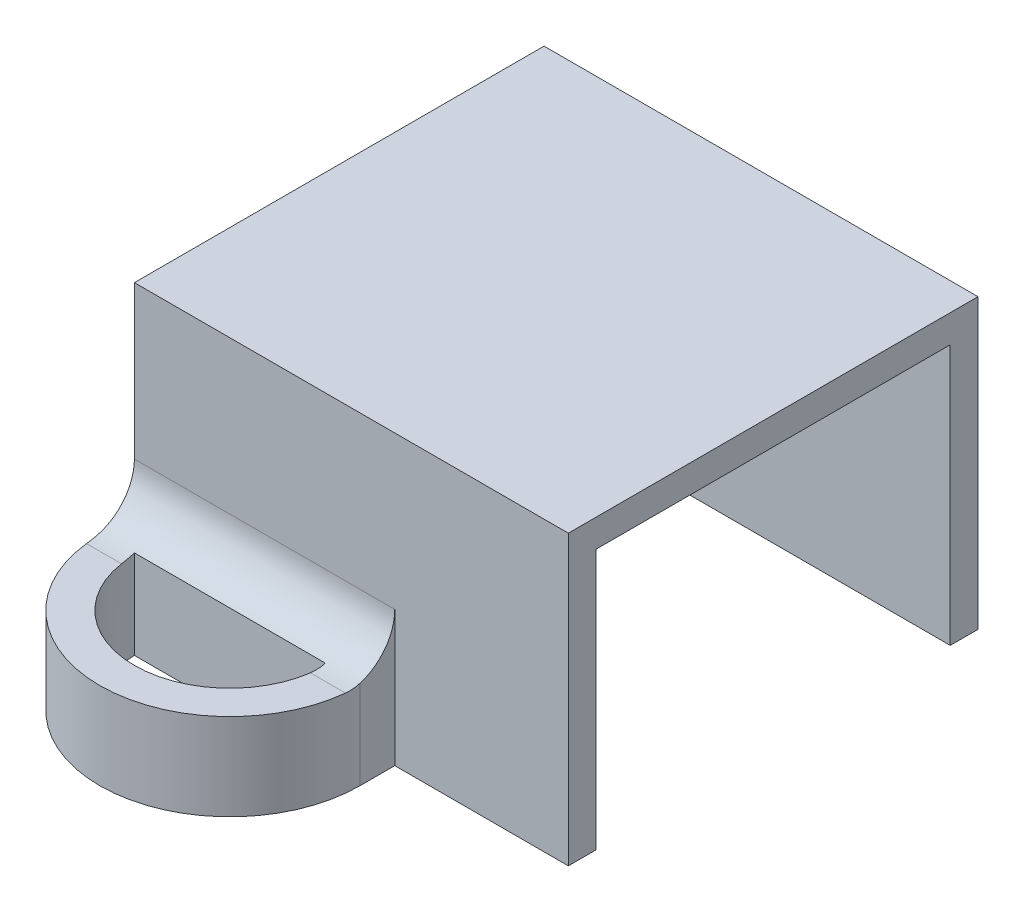
ISO-10303-21;
HEADER;
FILE_DESCRIPTION(('STEP AP214'),'2;1');
FILE_NAME('part.step','',(''),(''),'','','');
FILE_SCHEMA(('AUTOMOTIVE_DESIGN { 1 0 10303 214 1 1 1 1 }'));
ENDSEC;
DATA;
#1=APPLICATION_CONTEXT('core data for automotive mechanical design processes');
#2=APPLICATION_PROTOCOL_DEFINITION('international standard','automotive_design',2000,#1);
#3=PRODUCT_CONTEXT('',#1,'mechanical');
#4=PRODUCT('Part','Part','',(#3));
#5=PRODUCT_RELATED_PRODUCT_CATEGORY('part','',(#4));
#6=PRODUCT_DEFINITION_FORMATION('','',#4);
#7=PRODUCT_DEFINITION_CONTEXT('part definition',#1,'design');
#8=PRODUCT_DEFINITION('design','',#6,#7);
#9=PRODUCT_DEFINITION_SHAPE('','',#8);
#10=(LENGTH_UNIT() NAMED_UNIT(*) SI_UNIT(.MILLI.,.METRE.));
#11=(NAMED_UNIT(*) PLANE_ANGLE_UNIT() SI_UNIT($,.RADIAN.));
#12=(NAMED_UNIT(*) SI_UNIT($,.STERADIAN.) SOLID_ANGLE_UNIT());
#13=UNCERTAINTY_MEASURE_WITH_UNIT(LENGTH_MEASURE(1.E-05),#10,'distance_accuracy_value','');
#14=(GEOMETRIC_REPRESENTATION_CONTEXT(3) GLOBAL_UNCERTAINTY_ASSIGNED_CONTEXT((#13)) GLOBAL_UNIT_ASSIGNED_CONTEXT((#10,
#11,#12)) REPRESENTATION_CONTEXT('',''));
#15=CARTESIAN_POINT('',(0.,0.,0.));
#16=DIRECTION('',(0.,0.,1.));
#17=DIRECTION('',(1.,0.,0.));
#18=AXIS2_PLACEMENT_3D('',#15,#16,#17);
#19=CARTESIAN_POINT('',(15.875,0.,-13.97));
#20=DIRECTION('',(0.,1.,0.));
#21=DIRECTION('',(0.,0.,1.));
#22=AXIS2_PLACEMENT_3D('',#19,#20,#21);
#23=PLANE('',#22);
#24=DIRECTION('',(0.,0.,-1.));
#25=VECTOR('',#24,1.);
#26=CARTESIAN_POINT('',(0.,0.,-13.97));
#27=LINE('',#26,#25);
#28=CARTESIAN_POINT('',(0.,0.,-12.954));
#29=VERTEX_POINT('',#28);
#30=CARTESIAN_POINT('',(0.,0.,-15.24));
#31=VERTEX_POINT('',#30);
#32=EDGE_CURVE('E293',#29,#31,#27,.T.);
#33=ORIENTED_EDGE('',*,*,#32,.T.);
#34=CARTESIAN_POINT('',(4.7625,0.,-15.24));
#35=DIRECTION('',(0.,1.,0.));
#36=DIRECTION('',(0.,0.,1.));
#37=AXIS2_PLACEMENT_3D('',#34,#35,#36);
#38=CIRCLE('',#37,4.7625);
#39=CARTESIAN_POINT('',(9.525,0.,-15.24));
#40=VERTEX_POINT('',#39);
#41=EDGE_CURVE('E212',#40,#31,#38,.T.);
#42=ORIENTED_EDGE('',*,*,#41,.F.);
#43=DIRECTION('',(0.,0.,-1.));
#44=VECTOR('',#43,1.);
#45=CARTESIAN_POINT('',(9.525,0.,-15.24));
#46=LINE('',#45,#44);
#47=CARTESIAN_POINT('',(9.525,0.,-13.97));
#48=VERTEX_POINT('',#47);
#49=EDGE_CURVE('E230',#48,#40,#46,.T.);
#50=ORIENTED_EDGE('',*,*,#49,.F.);
#51=DIRECTION('',(-1.,0.,0.));
#52=VECTOR('',#51,1.);
#53=CARTESIAN_POINT('',(15.875,0.,-13.97));
#54=LINE('',#53,#52);
#55=CARTESIAN_POINT('',(15.875,0.,-13.97));
#56=VERTEX_POINT('',#55);
#57=EDGE_CURVE('E314',#56,#48,#54,.T.);
#58=ORIENTED_EDGE('',*,*,#57,.F.);
#59=DIRECTION('',(0.,0.,-1.));
#60=VECTOR('',#59,1.);
#61=CARTESIAN_POINT('',(15.875,0.,-13.97));
#62=LINE('',#61,#60);
#63=CARTESIAN_POINT('',(15.875,0.,-12.954));
#64=VERTEX_POINT('',#63);
#65=EDGE_CURVE('E276',#64,#56,#62,.T.);
#66=ORIENTED_EDGE('',*,*,#65,.F.);
#67=DIRECTION('',(-1.,0.,0.));
#68=VECTOR('',#67,1.);
#69=CARTESIAN_POINT('',(15.875,0.,-12.954));
#70=LINE('',#69,#68);
#71=EDGE_CURVE('E316',#64,#29,#70,.T.);
#72=ORIENTED_EDGE('',*,*,#71,.T.);
#73=EDGE_LOOP('',(#33,#42,#50,#58,#66,#72));
#74=FACE_BOUND('',#73,.T.);
#75=CARTESIAN_POINT('',(4.7625,0.,-15.24));
#76=DIRECTION('',(0.,1.,0.));
#77=DIRECTION('',(0.,0.,1.));
#78=AXIS2_PLACEMENT_3D('',#75,#76,#77);
#79=CIRCLE('',#78,3.4925);
#80=CARTESIAN_POINT('',(8.255,0.,-15.24));
#81=VERTEX_POINT('',#80);
#82=CARTESIAN_POINT('',(1.27,0.,-15.24));
#83=VERTEX_POINT('',#82);
#84=EDGE_CURVE('E216',#81,#83,#79,.T.);
#85=ORIENTED_EDGE('',*,*,#84,.T.);
#86=DIRECTION('',(1.,0.,0.));
#87=VECTOR('',#86,1.);
#88=CARTESIAN_POINT('',(8.255,0.,-15.24));
#89=LINE('',#88,#87);
#90=EDGE_CURVE('E202',#83,#81,#89,.T.);
#91=ORIENTED_EDGE('',*,*,#90,.T.);
#92=EDGE_LOOP('',(#85,#91));
#93=FACE_BOUND('',#92,.T.);
#94=ADVANCED_FACE('F47',(#74,#93),#23,.F.);
#95=CARTESIAN_POINT('',(4.7625,3.17499999999999,-15.24));
#96=DIRECTION('',(0.,-1.,0.));
#97=DIRECTION('',(0.,0.,1.));
#98=AXIS2_PLACEMENT_3D('',#95,#96,#97);
#99=PLANE('',#98);
#100=CARTESIAN_POINT('',(4.7625,3.17499999999999,-15.24));
#101=DIRECTION('',(0.,1.,0.));
#102=DIRECTION('',(0.,0.,1.));
#103=AXIS2_PLACEMENT_3D('',#100,#101,#102);
#104=CIRCLE('',#103,4.7625);
#105=CARTESIAN_POINT('',(9.49782915962555,3.17499999999999,-15.748));
#106=VERTEX_POINT('',#105);
#107=CARTESIAN_POINT('',(0.0271708403744514,3.17499999999999,-15.748));
#108=VERTEX_POINT('',#107);
#109=EDGE_CURVE('E227',#106,#108,#104,.T.);
#110=ORIENTED_EDGE('',*,*,#109,.T.);
#111=DIRECTION('',(1.,0.,0.));
#112=VECTOR('',#111,1.);
#113=CARTESIAN_POINT('',(9.525,3.17499999999999,-15.748));
#114=LINE('',#113,#112);
#115=CARTESIAN_POINT('',(1.30714296345515,3.17499999999999,-15.748));
#116=VERTEX_POINT('',#115);
#117=EDGE_CURVE('E381',#108,#116,#114,.T.);
#118=ORIENTED_EDGE('',*,*,#117,.T.);
#119=CARTESIAN_POINT('',(4.7625,3.17499999999999,-15.24));
#120=DIRECTION('',(0.,-1.,0.));
#121=DIRECTION('',(0.,0.,-1.));
#122=AXIS2_PLACEMENT_3D('',#119,#120,#121);
#123=CIRCLE('',#122,3.4925);
#124=CARTESIAN_POINT('',(8.21785703654485,3.17499999999999,-15.748));
#125=VERTEX_POINT('',#124);
#126=EDGE_CURVE('E220',#116,#125,#123,.T.);
#127=ORIENTED_EDGE('',*,*,#126,.T.);
#128=DIRECTION('',(1.,0.,0.));
#129=VECTOR('',#128,1.);
#130=CARTESIAN_POINT('',(9.525,3.17499999999999,-15.748));
#131=LINE('',#130,#129);
#132=EDGE_CURVE('E379',#125,#106,#131,.T.);
#133=ORIENTED_EDGE('',*,*,#132,.T.);
#134=EDGE_LOOP('',(#110,#118,#127,#133));
#135=FACE_BOUND('',#134,.T.);
#136=ADVANCED_FACE('F399',(#135),#99,.F.);
#137=CARTESIAN_POINT('',(15.875,0.,-13.97));
#138=DIRECTION('',(0.,0.,1.));
#139=DIRECTION('',(1.,0.,0.));
#140=AXIS2_PLACEMENT_3D('',#137,#138,#139);
#141=PLANE('',#140);
#142=DIRECTION('',(0.,-1.,0.));
#143=VECTOR('',#142,1.);
#144=CARTESIAN_POINT('',(9.525,3.17499999999999,-13.97));
#145=LINE('',#144,#143);
#146=CARTESIAN_POINT('',(9.525,4.95299999999999,-13.97));
#147=VERTEX_POINT('',#146);
#148=EDGE_CURVE('E233',#147,#48,#145,.T.);
#149=ORIENTED_EDGE('',*,*,#148,.F.);
#150=DIRECTION('',(1.,0.,0.));
#151=VECTOR('',#150,1.);
#152=CARTESIAN_POINT('',(0.,4.95299999999999,-13.97));
#153=LINE('',#152,#151);
#154=CARTESIAN_POINT('',(0.,4.95299999999999,-13.97));
#155=VERTEX_POINT('',#154);
#156=EDGE_CURVE('E384',#147,#155,#153,.F.);
#157=ORIENTED_EDGE('',*,*,#156,.T.);
#158=DIRECTION('',(0.,1.,0.));
#159=VECTOR('',#158,1.);
#160=CARTESIAN_POINT('',(0.,0.,-13.97));
#161=LINE('',#160,#159);
#162=CARTESIAN_POINT('',(0.,10.541,-13.97));
#163=VERTEX_POINT('',#162);
#164=EDGE_CURVE('E295',#155,#163,#161,.T.);
#165=ORIENTED_EDGE('',*,*,#164,.T.);
#166=DIRECTION('',(-1.,0.,0.));
#167=VECTOR('',#166,1.);
#168=CARTESIAN_POINT('',(15.875,10.541,-13.97));
#169=LINE('',#168,#167);
#170=CARTESIAN_POINT('',(15.875,10.541,-13.97));
#171=VERTEX_POINT('',#170);
#172=EDGE_CURVE('E311',#171,#163,#169,.T.);
#173=ORIENTED_EDGE('',*,*,#172,.F.);
#174=DIRECTION('',(0.,1.,0.));
#175=VECTOR('',#174,1.);
#176=CARTESIAN_POINT('',(15.875,0.,-13.97));
#177=LINE('',#176,#175);
#178=EDGE_CURVE('E278',#56,#171,#177,.T.);
#179=ORIENTED_EDGE('',*,*,#178,.F.);
#180=ORIENTED_EDGE('',*,*,#57,.T.);
#181=EDGE_LOOP('',(#149,#157,#165,#173,#179,#180));
#182=FACE_BOUND('',#181,.T.);
#183=ADVANCED_FACE('F438',(#182),#141,.F.);
#184=CARTESIAN_POINT('',(15.875,0.,0.));
#185=DIRECTION('',(0.,0.,1.));
#186=DIRECTION('',(1.,0.,0.));
#187=AXIS2_PLACEMENT_3D('',#184,#185,#186);
#188=PLANE('',#187);
#189=DIRECTION('',(0.,1.,0.));
#190=VECTOR('',#189,1.);
#191=CARTESIAN_POINT('',(0.,0.,0.));
#192=LINE('',#191,#190);
#193=CARTESIAN_POINT('',(0.,0.,0.));
#194=VERTEX_POINT('',#193);
#195=CARTESIAN_POINT('',(0.,9.525,0.));
#196=VERTEX_POINT('',#195);
#197=EDGE_CURVE('E263',#194,#196,#192,.T.);
#198=ORIENTED_EDGE('',*,*,#197,.T.);
#199=DIRECTION('',(-1.,0.,0.));
#200=VECTOR('',#199,1.);
#201=CARTESIAN_POINT('',(15.875,9.525,0.));
#202=LINE('',#201,#200);
#203=CARTESIAN_POINT('',(15.875,9.525,0.));
#204=VERTEX_POINT('',#203);
#205=EDGE_CURVE('E322',#204,#196,#202,.T.);
#206=ORIENTED_EDGE('',*,*,#205,.F.);
#207=DIRECTION('',(0.,1.,0.));
#208=VECTOR('',#207,1.);
#209=CARTESIAN_POINT('',(15.875,0.,0.));
#210=LINE('',#209,#208);
#211=CARTESIAN_POINT('',(15.875,0.,0.));
#212=VERTEX_POINT('',#211);
#213=EDGE_CURVE('E268',#212,#204,#210,.T.);
#214=ORIENTED_EDGE('',*,*,#213,.F.);
#215=DIRECTION('',(-1.,0.,0.));
#216=VECTOR('',#215,1.);
#217=CARTESIAN_POINT('',(15.875,0.,0.));
#218=LINE('',#217,#216);
#219=EDGE_CURVE('E286',#212,#194,#218,.T.);
#220=ORIENTED_EDGE('',*,*,#219,.T.);
#221=EDGE_LOOP('',(#198,#206,#214,#220));
#222=FACE_BOUND('',#221,.T.);
#223=ADVANCED_FACE('F450',(#222),#188,.F.);
#224=CARTESIAN_POINT('',(15.875,9.525,0.));
#225=DIRECTION('',(0.,1.,0.));
#226=DIRECTION('',(0.,0.,1.));
#227=AXIS2_PLACEMENT_3D('',#224,#225,#226);
#228=PLANE('',#227);
#229=DIRECTION('',(0.,0.,-1.));
#230=VECTOR('',#229,1.);
#231=CARTESIAN_POINT('',(0.,9.525,0.));
#232=LINE('',#231,#230);
#233=CARTESIAN_POINT('',(0.,9.525,-12.954));
#234=VERTEX_POINT('',#233);
#235=EDGE_CURVE('E289',#196,#234,#232,.T.);
#236=ORIENTED_EDGE('',*,*,#235,.T.);
#237=DIRECTION('',(-1.,0.,0.));
#238=VECTOR('',#237,1.);
#239=CARTESIAN_POINT('',(15.875,9.525,-12.954));
#240=LINE('',#239,#238);
#241=CARTESIAN_POINT('',(15.875,9.525,-12.954));
#242=VERTEX_POINT('',#241);
#243=EDGE_CURVE('E319',#242,#234,#240,.T.);
#244=ORIENTED_EDGE('',*,*,#243,.F.);
#245=DIRECTION('',(0.,0.,-1.));
#246=VECTOR('',#245,1.);
#247=CARTESIAN_POINT('',(15.875,9.525,0.));
#248=LINE('',#247,#246);
#249=EDGE_CURVE('E271',#204,#242,#248,.T.);
#250=ORIENTED_EDGE('',*,*,#249,.F.);
#251=ORIENTED_EDGE('',*,*,#205,.T.);
#252=EDGE_LOOP('',(#236,#244,#250,#251));
#253=FACE_BOUND('',#252,.T.);
#254=ADVANCED_FACE('F447',(#253),#228,.F.);
#255=CARTESIAN_POINT('',(15.875,0.,-12.954));
#256=DIRECTION('',(0.,0.,-1.));
#257=DIRECTION('',(-1.,0.,0.));
#258=AXIS2_PLACEMENT_3D('',#255,#256,#257);
#259=PLANE('',#258);
#260=DIRECTION('',(0.,-1.,0.));
#261=VECTOR('',#260,1.);
#262=CARTESIAN_POINT('',(0.,0.,-12.954));
#263=LINE('',#262,#261);
#264=EDGE_CURVE('E291',#234,#29,#263,.T.);
#265=ORIENTED_EDGE('',*,*,#264,.T.);
#266=ORIENTED_EDGE('',*,*,#71,.F.);
#267=DIRECTION('',(0.,-1.,0.));
#268=VECTOR('',#267,1.);
#269=CARTESIAN_POINT('',(15.875,0.,-12.954));
#270=LINE('',#269,#268);
#271=EDGE_CURVE('E274',#242,#64,#270,.T.);
#272=ORIENTED_EDGE('',*,*,#271,.F.);
#273=ORIENTED_EDGE('',*,*,#243,.T.);
#274=EDGE_LOOP('',(#265,#266,#272,#273));
#275=FACE_BOUND('',#274,.T.);
#276=ADVANCED_FACE('F443',(#275),#259,.F.);
#277=CARTESIAN_POINT('',(15.875,10.541,-13.97));
#278=DIRECTION('',(0.,-1.,0.));
#279=DIRECTION('',(0.,0.,-1.));
#280=AXIS2_PLACEMENT_3D('',#277,#278,#279);
#281=PLANE('',#280);
#282=DIRECTION('',(0.,0.,1.));
#283=VECTOR('',#282,1.);
#284=CARTESIAN_POINT('',(0.,10.541,-13.97));
#285=LINE('',#284,#283);
#286=CARTESIAN_POINT('',(0.,10.541,1.016));
#287=VERTEX_POINT('',#286);
#288=EDGE_CURVE('E297',#163,#287,#285,.T.);
#289=ORIENTED_EDGE('',*,*,#288,.T.);
#290=DIRECTION('',(-1.,0.,0.));
#291=VECTOR('',#290,1.);
#292=CARTESIAN_POINT('',(15.875,10.541,1.016));
#293=LINE('',#292,#291);
#294=CARTESIAN_POINT('',(15.875,10.541,1.016));
#295=VERTEX_POINT('',#294);
#296=EDGE_CURVE('E308',#295,#287,#293,.T.);
#297=ORIENTED_EDGE('',*,*,#296,.F.);
#298=DIRECTION('',(0.,0.,1.));
#299=VECTOR('',#298,1.);
#300=CARTESIAN_POINT('',(15.875,10.541,-13.97));
#301=LINE('',#300,#299);
#302=EDGE_CURVE('E280',#171,#295,#301,.T.);
#303=ORIENTED_EDGE('',*,*,#302,.F.);
#304=ORIENTED_EDGE('',*,*,#172,.T.);
#305=EDGE_LOOP('',(#289,#297,#303,#304));
#306=FACE_BOUND('',#305,.T.);
#307=ADVANCED_FACE('F446',(#306),#281,.F.);
#308=CARTESIAN_POINT('',(15.875,0.,1.016));
#309=DIRECTION('',(0.,0.,-1.));
#310=DIRECTION('',(0.,1.,0.));
#311=AXIS2_PLACEMENT_3D('',#308,#309,#310);
#312=PLANE('',#311);
#313=DIRECTION('',(0.,-1.,0.));
#314=VECTOR('',#313,1.);
#315=CARTESIAN_POINT('',(0.,0.,1.016));
#316=LINE('',#315,#314);
#317=CARTESIAN_POINT('',(0.,4.95299999999999,1.016));
#318=VERTEX_POINT('',#317);
#319=EDGE_CURVE('E299',#287,#318,#316,.T.);
#320=ORIENTED_EDGE('',*,*,#319,.T.);
#321=DIRECTION('',(1.,0.,0.));
#322=VECTOR('',#321,1.);
#323=CARTESIAN_POINT('',(9.525,4.95299999999999,1.016));
#324=LINE('',#323,#322);
#325=CARTESIAN_POINT('',(9.525,4.95299999999999,1.01600000000001));
#326=VERTEX_POINT('',#325);
#327=EDGE_CURVE('E325',#318,#326,#324,.T.);
#328=ORIENTED_EDGE('',*,*,#327,.T.);
#329=DIRECTION('',(0.,-1.,0.));
#330=VECTOR('',#329,1.);
#331=CARTESIAN_POINT('',(9.525,3.17499999999999,1.01600000000001));
#332=LINE('',#331,#330);
#333=CARTESIAN_POINT('',(9.525,0.,1.016));
#334=VERTEX_POINT('',#333);
#335=EDGE_CURVE('E254',#326,#334,#332,.T.);
#336=ORIENTED_EDGE('',*,*,#335,.T.);
#337=DIRECTION('',(-1.,0.,0.));
#338=VECTOR('',#337,1.);
#339=CARTESIAN_POINT('',(15.875,0.,1.016));
#340=LINE('',#339,#338);
#341=CARTESIAN_POINT('',(15.875,0.,1.016));
#342=VERTEX_POINT('',#341);
#343=EDGE_CURVE('E305',#342,#334,#340,.T.);
#344=ORIENTED_EDGE('',*,*,#343,.F.);
#345=DIRECTION('',(0.,-1.,0.));
#346=VECTOR('',#345,1.);
#347=CARTESIAN_POINT('',(15.875,0.,1.016));
#348=LINE('',#347,#346);
#349=EDGE_CURVE('E282',#295,#342,#348,.T.);
#350=ORIENTED_EDGE('',*,*,#349,.F.);
#351=ORIENTED_EDGE('',*,*,#296,.T.);
#352=EDGE_LOOP('',(#320,#328,#336,#344,#350,#351));
#353=FACE_BOUND('',#352,.T.);
#354=ADVANCED_FACE('F482',(#353),#312,.F.);
#355=CARTESIAN_POINT('',(15.875,0.,0.));
#356=DIRECTION('',(0.,1.,0.));
#357=DIRECTION('',(0.,0.,1.));
#358=AXIS2_PLACEMENT_3D('',#355,#356,#357);
#359=PLANE('',#358);
#360=DIRECTION('',(1.,0.,0.));
#361=VECTOR('',#360,1.);
#362=CARTESIAN_POINT('',(8.255,0.,2.286));
#363=LINE('',#362,#361);
#364=CARTESIAN_POINT('',(1.27,0.,2.286));
#365=VERTEX_POINT('',#364);
#366=CARTESIAN_POINT('',(8.255,0.,2.286));
#367=VERTEX_POINT('',#366);
#368=EDGE_CURVE('E246',#365,#367,#363,.T.);
#369=ORIENTED_EDGE('',*,*,#368,.F.);
#370=CARTESIAN_POINT('',(4.7625,0.,2.286));
#371=DIRECTION('',(0.,1.,0.));
#372=DIRECTION('',(0.,0.,1.));
#373=AXIS2_PLACEMENT_3D('',#370,#371,#372);
#374=CIRCLE('',#373,3.4925);
#375=EDGE_CURVE('E236',#367,#365,#374,.F.);
#376=ORIENTED_EDGE('',*,*,#375,.F.);
#377=EDGE_LOOP('',(#369,#376));
#378=FACE_BOUND('',#377,.T.);
#379=DIRECTION('',(0.,0.,-1.));
#380=VECTOR('',#379,1.);
#381=CARTESIAN_POINT('',(0.,0.,0.));
#382=LINE('',#381,#380);
#383=CARTESIAN_POINT('',(0.,0.,2.286));
#384=VERTEX_POINT('',#383);
#385=EDGE_CURVE('E272',#384,#194,#382,.T.);
#386=ORIENTED_EDGE('',*,*,#385,.T.);
#387=ORIENTED_EDGE('',*,*,#219,.F.);
#388=DIRECTION('',(0.,0.,-1.));
#389=VECTOR('',#388,1.);
#390=CARTESIAN_POINT('',(15.875,0.,0.));
#391=LINE('',#390,#389);
#392=EDGE_CURVE('E284',#342,#212,#391,.T.);
#393=ORIENTED_EDGE('',*,*,#392,.F.);
#394=ORIENTED_EDGE('',*,*,#343,.T.);
#395=DIRECTION('',(0.,0.,1.));
#396=VECTOR('',#395,1.);
#397=CARTESIAN_POINT('',(9.525,0.,2.286));
#398=LINE('',#397,#396);
#399=CARTESIAN_POINT('',(9.525,0.,2.286));
#400=VERTEX_POINT('',#399);
#401=EDGE_CURVE('E250',#334,#400,#398,.T.);
#402=ORIENTED_EDGE('',*,*,#401,.T.);
#403=CARTESIAN_POINT('',(4.7625,0.,2.286));
#404=DIRECTION('',(0.,-1.,0.));
#405=DIRECTION('',(0.,0.,-1.));
#406=AXIS2_PLACEMENT_3D('',#403,#404,#405);
#407=CIRCLE('',#406,4.7625);
#408=EDGE_CURVE('E255',#400,#384,#407,.T.);
#409=ORIENTED_EDGE('',*,*,#408,.T.);
#410=EDGE_LOOP('',(#386,#387,#393,#394,#402,#409));
#411=FACE_BOUND('',#410,.T.);
#412=ADVANCED_FACE('F473',(#378,#411),#359,.F.);
#413=CARTESIAN_POINT('',(15.875,0.,0.));
#414=DIRECTION('',(-1.,0.,0.));
#415=DIRECTION('',(0.,0.,1.));
#416=AXIS2_PLACEMENT_3D('',#413,#414,#415);
#417=PLANE('',#416);
#418=ORIENTED_EDGE('',*,*,#213,.T.);
#419=ORIENTED_EDGE('',*,*,#249,.T.);
#420=ORIENTED_EDGE('',*,*,#271,.T.);
#421=ORIENTED_EDGE('',*,*,#65,.T.);
#422=ORIENTED_EDGE('',*,*,#178,.T.);
#423=ORIENTED_EDGE('',*,*,#302,.T.);
#424=ORIENTED_EDGE('',*,*,#349,.T.);
#425=ORIENTED_EDGE('',*,*,#392,.T.);
#426=EDGE_LOOP('',(#418,#419,#420,#421,#422,#423,#424,#425));
#427=FACE_BOUND('',#426,.T.);
#428=ADVANCED_FACE('F468',(#427),#417,.F.);
#429=CARTESIAN_POINT('',(0.,0.,0.));
#430=DIRECTION('',(-1.,0.,0.));
#431=DIRECTION('',(0.,0.,1.));
#432=AXIS2_PLACEMENT_3D('',#429,#430,#431);
#433=PLANE('',#432);
#434=ORIENTED_EDGE('',*,*,#197,.F.);
#435=ORIENTED_EDGE('',*,*,#385,.F.);
#436=DIRECTION('',(0.,-1.,0.));
#437=VECTOR('',#436,1.);
#438=CARTESIAN_POINT('',(0.,3.17499999999999,2.28600000000001));
#439=LINE('',#438,#437);
#440=CARTESIAN_POINT('',(0.,3.24911620114515,2.28600000000001));
#441=VERTEX_POINT('',#440);
#442=EDGE_CURVE('E260',#441,#384,#439,.T.);
#443=ORIENTED_EDGE('',*,*,#442,.F.);
#444=CARTESIAN_POINT('',(0.,4.95299999999999,2.794));
#445=DIRECTION('',(-1.,0.,0.));
#446=DIRECTION('',(0.,0.,1.));
#447=AXIS2_PLACEMENT_3D('',#444,#445,#446);
#448=CIRCLE('',#447,1.778);
#449=EDGE_CURVE('E372',#441,#318,#448,.F.);
#450=ORIENTED_EDGE('',*,*,#449,.T.);
#451=ORIENTED_EDGE('',*,*,#319,.F.);
#452=ORIENTED_EDGE('',*,*,#288,.F.);
#453=ORIENTED_EDGE('',*,*,#164,.F.);
#454=CARTESIAN_POINT('',(0.,4.95299999999999,-15.748));
#455=DIRECTION('',(-1.,0.,0.));
#456=DIRECTION('',(0.,0.,1.));
#457=AXIS2_PLACEMENT_3D('',#454,#455,#456);
#458=CIRCLE('',#457,1.778);
#459=CARTESIAN_POINT('',(0.,3.24911620114515,-15.24));
#460=VERTEX_POINT('',#459);
#461=EDGE_CURVE('E61',#155,#460,#458,.F.);
#462=ORIENTED_EDGE('',*,*,#461,.T.);
#463=DIRECTION('',(0.,-1.,0.));
#464=VECTOR('',#463,1.);
#465=CARTESIAN_POINT('',(0.,3.17499999999999,-15.24));
#466=LINE('',#465,#464);
#467=EDGE_CURVE('E67',#460,#31,#466,.T.);
#468=ORIENTED_EDGE('',*,*,#467,.T.);
#469=ORIENTED_EDGE('',*,*,#32,.F.);
#470=ORIENTED_EDGE('',*,*,#264,.F.);
#471=ORIENTED_EDGE('',*,*,#235,.F.);
#472=EDGE_LOOP('',(#434,#435,#443,#450,#451,#452,#453,#462,#468,#469,#470,#471));
#473=FACE_BOUND('',#472,.T.);
#474=ADVANCED_FACE('F358',(#473),#433,.T.);
#475=CARTESIAN_POINT('',(4.7625,3.17499999999999,2.28600000000001));
#476=DIRECTION('',(0.,-1.,0.));
#477=DIRECTION('',(0.,0.,-1.));
#478=AXIS2_PLACEMENT_3D('',#475,#476,#477);
#479=CYLINDRICAL_SURFACE('',#478,4.7625);
#480=ORIENTED_EDGE('',*,*,#408,.F.);
#481=DIRECTION('',(0.,-1.,0.));
#482=VECTOR('',#481,1.);
#483=CARTESIAN_POINT('',(9.525,3.17499999999999,2.28600000000001));
#484=LINE('',#483,#482);
#485=CARTESIAN_POINT('',(9.525,3.24911620114515,2.28600000000001));
#486=VERTEX_POINT('',#485);
#487=EDGE_CURVE('E264',#486,#400,#484,.T.);
#488=ORIENTED_EDGE('',*,*,#487,.F.);
#489=CARTESIAN_POINT('',(9.525,3.24911620114515,2.28600000000001));
#490=CARTESIAN_POINT('',(9.52500392317004,3.236786562111,2.32733989358092));
#491=CARTESIAN_POINT('',(9.5244617359255,3.22596954748964,2.36913129188568));
#492=CARTESIAN_POINT('',(9.52225049826681,3.20745913739436,2.45311119327404));
#493=CARTESIAN_POINT('',(9.52058813596217,3.1997476342733,2.49529588237194));
#494=CARTESIAN_POINT('',(9.5161028834709,3.18739975957021,2.58005186107808));
#495=CARTESIAN_POINT('',(9.5132799931568,3.18276338832594,2.62262315072878));
#496=CARTESIAN_POINT('',(9.50644948412119,3.17655214922777,2.7081504240376));
#497=CARTESIAN_POINT('',(9.50243491226996,3.17499567210705,2.75110718907797));
#498=CARTESIAN_POINT('',(9.49782915962555,3.17499999999999,2.794));
#499=B_SPLINE_CURVE_WITH_KNOTS('',3,(#489,#490,#491,#492,#493,#494,#495,#496,#497,#498),
.UNSPECIFIED.,.F.,.F.,(4,2,2,2,4),(0.,0.129386635269593,0.258007521111593,0.386628421081134,
0.516015054867562),.UNSPECIFIED.);
#500=CARTESIAN_POINT('',(9.49782915962555,3.17499999999999,2.794));
#501=VERTEX_POINT('',#500);
#502=EDGE_CURVE('E335',#486,#501,#499,.T.);
#503=ORIENTED_EDGE('',*,*,#502,.T.);
#504=CARTESIAN_POINT('',(4.7625,3.17499999999999,2.28600000000001));
#505=DIRECTION('',(0.,-1.,0.));
#506=DIRECTION('',(0.,0.,-1.));
#507=AXIS2_PLACEMENT_3D('',#504,#505,#506);
#508=CIRCLE('',#507,4.7625);
#509=CARTESIAN_POINT('',(0.0271708403744514,3.17499999999999,2.794));
#510=VERTEX_POINT('',#509);
#511=EDGE_CURVE('E251',#501,#510,#508,.T.);
#512=ORIENTED_EDGE('',*,*,#511,.T.);
#513=CARTESIAN_POINT('',(0.0271708403744514,3.17499999999999,2.794));
#514=CARTESIAN_POINT('',(0.0225650877300401,3.17499567210705,2.75110718907797));
#515=CARTESIAN_POINT('',(0.0185505158788084,3.17655214922777,2.7081504240376));
#516=CARTESIAN_POINT('',(0.0117200068432044,3.18276338832594,2.62262315072878));
#517=CARTESIAN_POINT('',(0.00889711652910184,3.18739975957021,2.58005186107808));
#518=CARTESIAN_POINT('',(0.00441186403782966,3.1997476342733,2.49529588237194));
#519=CARTESIAN_POINT('',(0.00274950173318929,3.20745913739436,2.45311119327404));
#520=CARTESIAN_POINT('',(0.000538264074499382,3.22596954748964,2.36913129188568));
#521=CARTESIAN_POINT('',(-3.92317003880879E-06,3.23678656211101,2.32733989358092));
#522=CARTESIAN_POINT('',(0.,3.24911620114515,2.28600000000001));
#523=B_SPLINE_CURVE_WITH_KNOTS('',3,(#513,#514,#515,#516,#517,#518,#519,#520,#521,#522),
.UNSPECIFIED.,.F.,.F.,(4,2,2,2,4),(0.,0.129386633786428,0.258007533755969,0.386628419597969,
0.516015054867561),.UNSPECIFIED.);
#524=EDGE_CURVE('E364',#510,#441,#523,.T.);
#525=ORIENTED_EDGE('',*,*,#524,.T.);
#526=ORIENTED_EDGE('',*,*,#442,.T.);
#527=EDGE_LOOP('',(#480,#488,#503,#512,#525,#526));
#528=FACE_BOUND('',#527,.T.);
#529=ADVANCED_FACE('F352',(#528),#479,.T.);
#530=CARTESIAN_POINT('',(9.525,3.17499999999999,2.28600000000001));
#531=DIRECTION('',(1.,0.,0.));
#532=DIRECTION('',(0.,0.,-1.));
#533=AXIS2_PLACEMENT_3D('',#530,#531,#532);
#534=PLANE('',#533);
#535=ORIENTED_EDGE('',*,*,#401,.F.);
#536=ORIENTED_EDGE('',*,*,#335,.F.);
#537=CARTESIAN_POINT('',(9.525,4.95299999999999,2.794));
#538=DIRECTION('',(1.,0.,0.));
#539=DIRECTION('',(0.,0.,-1.));
#540=AXIS2_PLACEMENT_3D('',#537,#538,#539);
#541=CIRCLE('',#540,1.778);
#542=EDGE_CURVE('E332',#326,#486,#541,.F.);
#543=ORIENTED_EDGE('',*,*,#542,.T.);
#544=ORIENTED_EDGE('',*,*,#487,.T.);
#545=EDGE_LOOP('',(#535,#536,#543,#544));
#546=FACE_BOUND('',#545,.T.);
#547=ADVANCED_FACE('F357',(#546),#534,.T.);
#548=CARTESIAN_POINT('',(4.7625,3.17499999999999,2.28600000000001));
#549=DIRECTION('',(0.,-1.,0.));
#550=DIRECTION('',(0.,0.,-1.));
#551=AXIS2_PLACEMENT_3D('',#548,#549,#550);
#552=PLANE('',#551);
#553=ORIENTED_EDGE('',*,*,#511,.F.);
#554=DIRECTION('',(1.,0.,0.));
#555=VECTOR('',#554,1.);
#556=CARTESIAN_POINT('',(0.,3.17499999999999,2.794));
#557=LINE('',#556,#555);
#558=CARTESIAN_POINT('',(8.21785703654485,3.17499999999999,2.794));
#559=VERTEX_POINT('',#558);
#560=EDGE_CURVE('E330',#501,#559,#557,.F.);
#561=ORIENTED_EDGE('',*,*,#560,.T.);
#562=CARTESIAN_POINT('',(4.7625,3.17499999999999,2.28600000000001));
#563=DIRECTION('',(0.,1.,0.));
#564=DIRECTION('',(0.,0.,1.));
#565=AXIS2_PLACEMENT_3D('',#562,#563,#564);
#566=CIRCLE('',#565,3.4925);
#567=CARTESIAN_POINT('',(1.30714296345515,3.17499999999999,2.794));
#568=VERTEX_POINT('',#567);
#569=EDGE_CURVE('E240',#568,#559,#566,.T.);
#570=ORIENTED_EDGE('',*,*,#569,.F.);
#571=DIRECTION('',(1.,0.,0.));
#572=VECTOR('',#571,1.);
#573=CARTESIAN_POINT('',(0.,3.17499999999999,2.794));
#574=LINE('',#573,#572);
#575=EDGE_CURVE('E328',#568,#510,#574,.F.);
#576=ORIENTED_EDGE('',*,*,#575,.T.);
#577=EDGE_LOOP('',(#553,#561,#570,#576));
#578=FACE_BOUND('',#577,.T.);
#579=ADVANCED_FACE('F360',(#578),#552,.F.);
#580=CARTESIAN_POINT('',(4.7625,-0.0010000000000383,2.286));
#581=DIRECTION('',(0.,1.,0.));
#582=DIRECTION('',(0.,0.,1.));
#583=AXIS2_PLACEMENT_3D('',#580,#581,#582);
#584=CYLINDRICAL_SURFACE('',#583,3.4925);
#585=ORIENTED_EDGE('',*,*,#375,.T.);
#586=DIRECTION('',(0.,1.,0.));
#587=VECTOR('',#586,1.);
#588=CARTESIAN_POINT('',(1.27,-0.0010000000000383,2.286));
#589=LINE('',#588,#587);
#590=CARTESIAN_POINT('',(1.27,3.24911620114515,2.28600000000001));
#591=VERTEX_POINT('',#590);
#592=EDGE_CURVE('E244',#365,#591,#589,.T.);
#593=ORIENTED_EDGE('',*,*,#592,.T.);
#594=CARTESIAN_POINT('',(1.27,3.24911620114515,2.28600000000001));
#595=CARTESIAN_POINT('',(1.26999441997032,3.2367616413341,2.32741874295421));
#596=CARTESIAN_POINT('',(1.27073680853153,3.22592784616331,2.36929222392702));
#597=CARTESIAN_POINT('',(1.27376284463094,3.20740453848305,2.45338707337095));
#598=CARTESIAN_POINT('',(1.27603640534776,3.19969497369123,2.49560438995209));
#599=CARTESIAN_POINT('',(1.282168667183,3.18736071310043,2.58037322719843));
#600=CARTESIAN_POINT('',(1.28602736858076,3.18273601784509,2.62292474792253));
#601=CARTESIAN_POINT('',(1.29536289856668,3.17654268048962,2.70835721130585));
#602=CARTESIAN_POINT('',(1.30085018648433,3.17499430593184,2.75123848229747));
#603=CARTESIAN_POINT('',(1.30714296345515,3.17499999999999,2.794));
#604=B_SPLINE_CURVE_WITH_KNOTS('',3,(#594,#595,#596,#597,#598,#599,#600,#601,#602,#603),
.UNSPECIFIED.,.F.,.F.,(4,2,2,2,4),(0.,0.129632546726245,0.258419366552159,0.387206209073946,
0.51683875343041),.UNSPECIFIED.);
#605=EDGE_CURVE('E373',#591,#568,#604,.T.);
#606=ORIENTED_EDGE('',*,*,#605,.T.);
#607=ORIENTED_EDGE('',*,*,#569,.T.);
#608=CARTESIAN_POINT('',(8.21785703654485,3.17499999999999,2.794));
#609=CARTESIAN_POINT('',(8.22414981351567,3.17499430593184,2.75123848229747));
#610=CARTESIAN_POINT('',(8.22963710143332,3.17654268048962,2.70835721130585));
#611=CARTESIAN_POINT('',(8.23897263141924,3.18273601784509,2.62292474792253));
#612=CARTESIAN_POINT('',(8.242831332817,3.18736071310043,2.58037322719843));
#613=CARTESIAN_POINT('',(8.24896359465224,3.19969497369123,2.49560438995209));
#614=CARTESIAN_POINT('',(8.25123715536906,3.20740453848305,2.45338707337095));
#615=CARTESIAN_POINT('',(8.25426319146847,3.22592784616331,2.36929222392702));
#616=CARTESIAN_POINT('',(8.25500558002968,3.2367616413341,2.32741874295421));
#617=CARTESIAN_POINT('',(8.255,3.24911620114515,2.28600000000001));
#618=B_SPLINE_CURVE_WITH_KNOTS('',3,(#608,#609,#610,#611,#612,#613,#614,#615,#616,#617),
.UNSPECIFIED.,.F.,.F.,(4,2,2,2,4),(0.,0.129632544356463,0.258419386878251,0.387206206704164,
0.516838753430409),.UNSPECIFIED.);
#619=CARTESIAN_POINT('',(8.255,3.24911620114515,2.28600000000001));
#620=VERTEX_POINT('',#619);
#621=EDGE_CURVE('E342',#559,#620,#618,.T.);
#622=ORIENTED_EDGE('',*,*,#621,.T.);
#623=DIRECTION('',(0.,1.,0.));
#624=VECTOR('',#623,1.);
#625=CARTESIAN_POINT('',(8.255,-0.0010000000000383,2.286));
#626=LINE('',#625,#624);
#627=EDGE_CURVE('E243',#367,#620,#626,.T.);
#628=ORIENTED_EDGE('',*,*,#627,.F.);
#629=EDGE_LOOP('',(#585,#593,#606,#607,#622,#628));
#630=FACE_BOUND('',#629,.T.);
#631=ADVANCED_FACE('F422',(#630),#584,.F.);
#632=CARTESIAN_POINT('',(8.255,-0.0010000000000383,2.286));
#633=DIRECTION('',(0.,0.,-1.));
#634=DIRECTION('',(0.,1.,0.));
#635=AXIS2_PLACEMENT_3D('',#632,#633,#634);
#636=PLANE('',#635);
#637=ORIENTED_EDGE('',*,*,#368,.T.);
#638=ORIENTED_EDGE('',*,*,#627,.T.);
#639=DIRECTION('',(-1.,0.,0.));
#640=VECTOR('',#639,1.);
#641=CARTESIAN_POINT('',(8.255,3.24911620114515,2.28600000000001));
#642=LINE('',#641,#640);
#643=EDGE_CURVE('E665',#620,#591,#642,.T.);
#644=ORIENTED_EDGE('',*,*,#643,.T.);
#645=ORIENTED_EDGE('',*,*,#592,.F.);
#646=EDGE_LOOP('',(#637,#638,#644,#645));
#647=FACE_BOUND('',#646,.T.);
#648=ADVANCED_FACE('F419',(#647),#636,.F.);
#649=CARTESIAN_POINT('',(15.875,4.95299999999999,2.794));
#650=DIRECTION('',(-1.,0.,0.));
#651=DIRECTION('',(0.,0.,1.));
#652=AXIS2_PLACEMENT_3D('',#649,#650,#651);
#653=CYLINDRICAL_SURFACE('',#652,1.778);
#654=ORIENTED_EDGE('',*,*,#621,.F.);
#655=ORIENTED_EDGE('',*,*,#560,.F.);
#656=ORIENTED_EDGE('',*,*,#502,.F.);
#657=ORIENTED_EDGE('',*,*,#542,.F.);
#658=ORIENTED_EDGE('',*,*,#327,.F.);
#659=ORIENTED_EDGE('',*,*,#449,.F.);
#660=ORIENTED_EDGE('',*,*,#524,.F.);
#661=ORIENTED_EDGE('',*,*,#575,.F.);
#662=ORIENTED_EDGE('',*,*,#605,.F.);
#663=ORIENTED_EDGE('',*,*,#643,.F.);
#664=EDGE_LOOP('',(#654,#655,#656,#657,#658,#659,#660,#661,#662,#663));
#665=FACE_BOUND('',#664,.T.);
#666=ADVANCED_FACE('F349',(#665),#653,.F.);
#667=CARTESIAN_POINT('',(9.525,3.17499999999999,-15.24));
#668=DIRECTION('',(-1.,0.,0.));
#669=DIRECTION('',(0.,0.,1.));
#670=AXIS2_PLACEMENT_3D('',#667,#668,#669);
#671=PLANE('',#670);
#672=ORIENTED_EDGE('',*,*,#49,.T.);
#673=DIRECTION('',(0.,-1.,0.));
#674=VECTOR('',#673,1.);
#675=CARTESIAN_POINT('',(9.525,3.17499999999999,-15.24));
#676=LINE('',#675,#674);
#677=CARTESIAN_POINT('',(9.525,3.24911620114515,-15.24));
#678=VERTEX_POINT('',#677);
#679=EDGE_CURVE('E75',#678,#40,#676,.T.);
#680=ORIENTED_EDGE('',*,*,#679,.F.);
#681=CARTESIAN_POINT('',(9.525,4.95299999999999,-15.748));
#682=DIRECTION('',(-1.,0.,0.));
#683=DIRECTION('',(0.,0.,1.));
#684=AXIS2_PLACEMENT_3D('',#681,#682,#683);
#685=CIRCLE('',#684,1.778);
#686=EDGE_CURVE('E414',#678,#147,#685,.T.);
#687=ORIENTED_EDGE('',*,*,#686,.T.);
#688=ORIENTED_EDGE('',*,*,#148,.T.);
#689=EDGE_LOOP('',(#672,#680,#687,#688));
#690=FACE_BOUND('',#689,.T.);
#691=ADVANCED_FACE('F418',(#690),#671,.F.);
#692=CARTESIAN_POINT('',(4.7625,3.17499999999999,-15.24));
#693=DIRECTION('',(0.,-1.,0.));
#694=DIRECTION('',(0.,0.,-1.));
#695=AXIS2_PLACEMENT_3D('',#692,#693,#694);
#696=CYLINDRICAL_SURFACE('',#695,4.7625);
#697=ORIENTED_EDGE('',*,*,#41,.T.);
#698=ORIENTED_EDGE('',*,*,#467,.F.);
#699=CARTESIAN_POINT('',(0.,3.24911620114515,-15.24));
#700=CARTESIAN_POINT('',(-3.92317003876708E-06,3.236786562111,-15.2813398935809));
#701=CARTESIAN_POINT('',(0.000538264074499623,3.22596954748964,-15.3231312918857));
#702=CARTESIAN_POINT('',(0.00274950173318935,3.20745913739436,-15.407111193274));
#703=CARTESIAN_POINT('',(0.00441186403782936,3.1997476342733,-15.4492958823719));
#704=CARTESIAN_POINT('',(0.00889711652910145,3.1873997595702,-15.5340518610781));
#705=CARTESIAN_POINT('',(0.0117200068432043,3.18276338832594,-15.5766231507288));
#706=CARTESIAN_POINT('',(0.0185505158788087,3.17655214922777,-15.6621504240376));
#707=CARTESIAN_POINT('',(0.0225650877300407,3.17499567210705,-15.705107189078));
#708=CARTESIAN_POINT('',(0.0271708403744519,3.17499999999999,-15.748));
#709=B_SPLINE_CURVE_WITH_KNOTS('',3,(#699,#700,#701,#702,#703,#704,#705,#706,#707,#708),
.UNSPECIFIED.,.F.,.F.,(4,2,2,2,4),(0.,0.129386635269593,0.258007521111593,0.386628421081133,
0.516015054867561),.UNSPECIFIED.);
#710=EDGE_CURVE('E13',#460,#108,#709,.T.);
#711=ORIENTED_EDGE('',*,*,#710,.T.);
#712=ORIENTED_EDGE('',*,*,#109,.F.);
#713=CARTESIAN_POINT('',(9.49782915962555,3.17499999999999,-15.748));
#714=CARTESIAN_POINT('',(9.50243491226996,3.17499567210705,-15.705107189078));
#715=CARTESIAN_POINT('',(9.50644948412119,3.17655214922777,-15.6621504240376));
#716=CARTESIAN_POINT('',(9.5132799931568,3.18276338832594,-15.5766231507288));
#717=CARTESIAN_POINT('',(9.5161028834709,3.1873997595702,-15.5340518610781));
#718=CARTESIAN_POINT('',(9.52058813596217,3.1997476342733,-15.4492958823719));
#719=CARTESIAN_POINT('',(9.52225049826681,3.20745913739436,-15.407111193274));
#720=CARTESIAN_POINT('',(9.5244617359255,3.22596954748964,-15.3231312918857));
#721=CARTESIAN_POINT('',(9.52500392317004,3.23678656211101,-15.2813398935809));
#722=CARTESIAN_POINT('',(9.525,3.24911620114515,-15.24));
#723=B_SPLINE_CURVE_WITH_KNOTS('',3,(#713,#714,#715,#716,#717,#718,#719,#720,#721,#722),
.UNSPECIFIED.,.F.,.F.,(4,2,2,2,4),(0.,0.129386633786429,0.258007533755969,0.386628419597967,
0.51601505486756),.UNSPECIFIED.);
#724=EDGE_CURVE('E408',#106,#678,#723,.T.);
#725=ORIENTED_EDGE('',*,*,#724,.T.);
#726=ORIENTED_EDGE('',*,*,#679,.T.);
#727=EDGE_LOOP('',(#697,#698,#711,#712,#725,#726));
#728=FACE_BOUND('',#727,.T.);
#729=ADVANCED_FACE('F398',(#728),#696,.T.);
#730=CARTESIAN_POINT('',(4.7625,-0.00100000000005044,-15.24));
#731=DIRECTION('',(0.,1.,0.));
#732=DIRECTION('',(0.,0.,1.));
#733=AXIS2_PLACEMENT_3D('',#730,#731,#732);
#734=CYLINDRICAL_SURFACE('',#733,3.4925);
#735=DIRECTION('',(0.,1.,0.));
#736=VECTOR('',#735,1.);
#737=CARTESIAN_POINT('',(8.255,-0.00100000000005044,-15.24));
#738=LINE('',#737,#736);
#739=CARTESIAN_POINT('',(8.255,3.24911620114515,-15.24));
#740=VERTEX_POINT('',#739);
#741=EDGE_CURVE('E208',#81,#740,#738,.T.);
#742=ORIENTED_EDGE('',*,*,#741,.T.);
#743=CARTESIAN_POINT('',(8.255,3.24911620114515,-15.24));
#744=CARTESIAN_POINT('',(8.25500558002968,3.2367616413341,-15.2814187429542));
#745=CARTESIAN_POINT('',(8.25426319146847,3.22592784616331,-15.323292223927));
#746=CARTESIAN_POINT('',(8.25123715536906,3.20740453848305,-15.407387073371));
#747=CARTESIAN_POINT('',(8.24896359465224,3.19969497369123,-15.4496043899521));
#748=CARTESIAN_POINT('',(8.242831332817,3.18736071310043,-15.5343732271984));
#749=CARTESIAN_POINT('',(8.23897263141924,3.18273601784509,-15.5769247479225));
#750=CARTESIAN_POINT('',(8.22963710143332,3.17654268048962,-15.6623572113059));
#751=CARTESIAN_POINT('',(8.22414981351567,3.17499430593184,-15.7052384822975));
#752=CARTESIAN_POINT('',(8.21785703654485,3.17499999999999,-15.748));
#753=B_SPLINE_CURVE_WITH_KNOTS('',3,(#743,#744,#745,#746,#747,#748,#749,#750,#751,#752),
.UNSPECIFIED.,.F.,.F.,(4,2,2,2,4),(0.,0.129632546726246,0.25841936655216,0.387206209073949,
0.51683875343041),.UNSPECIFIED.);
#754=EDGE_CURVE('E402',#740,#125,#753,.T.);
#755=ORIENTED_EDGE('',*,*,#754,.T.);
#756=ORIENTED_EDGE('',*,*,#126,.F.);
#757=CARTESIAN_POINT('',(1.30714296345515,3.17499999999999,-15.748));
#758=CARTESIAN_POINT('',(1.30085018648433,3.17499430593184,-15.7052384822975));
#759=CARTESIAN_POINT('',(1.29536289856668,3.17654268048962,-15.6623572113058));
#760=CARTESIAN_POINT('',(1.28602736858076,3.18273601784509,-15.5769247479225));
#761=CARTESIAN_POINT('',(1.282168667183,3.18736071310043,-15.5343732271984));
#762=CARTESIAN_POINT('',(1.27603640534776,3.19969497369123,-15.4496043899521));
#763=CARTESIAN_POINT('',(1.27376284463094,3.20740453848305,-15.407387073371));
#764=CARTESIAN_POINT('',(1.27073680853153,3.22592784616331,-15.323292223927));
#765=CARTESIAN_POINT('',(1.26999441997032,3.2367616413341,-15.2814187429542));
#766=CARTESIAN_POINT('',(1.27,3.24911620114515,-15.24));
#767=B_SPLINE_CURVE_WITH_KNOTS('',3,(#757,#758,#759,#760,#761,#762,#763,#764,#765,#766),
.UNSPECIFIED.,.F.,.F.,(4,2,2,2,4),(0.,0.129632544356463,0.258419386878249,0.387206206704161,
0.516838753430405),.UNSPECIFIED.);
#768=CARTESIAN_POINT('',(1.27,3.24911620114515,-15.24));
#769=VERTEX_POINT('',#768);
#770=EDGE_CURVE('E218',#116,#769,#767,.T.);
#771=ORIENTED_EDGE('',*,*,#770,.T.);
#772=DIRECTION('',(0.,1.,0.));
#773=VECTOR('',#772,1.);
#774=CARTESIAN_POINT('',(1.27,-0.00100000000005044,-15.24));
#775=LINE('',#774,#773);
#776=EDGE_CURVE('E206',#83,#769,#775,.T.);
#777=ORIENTED_EDGE('',*,*,#776,.F.);
#778=ORIENTED_EDGE('',*,*,#84,.F.);
#779=EDGE_LOOP('',(#742,#755,#756,#771,#777,#778));
#780=FACE_BOUND('',#779,.T.);
#781=ADVANCED_FACE('F215',(#780),#734,.F.);
#782=CARTESIAN_POINT('',(8.255,-0.00100000000005044,-15.24));
#783=DIRECTION('',(0.,0.,-1.));
#784=DIRECTION('',(0.,1.,0.));
#785=AXIS2_PLACEMENT_3D('',#782,#783,#784);
#786=PLANE('',#785);
#787=ORIENTED_EDGE('',*,*,#776,.T.);
#788=DIRECTION('',(-1.,0.,0.));
#789=VECTOR('',#788,1.);
#790=CARTESIAN_POINT('',(1.27,3.24911620114515,-15.24));
#791=LINE('',#790,#789);
#792=EDGE_CURVE('E392',#769,#740,#791,.F.);
#793=ORIENTED_EDGE('',*,*,#792,.T.);
#794=ORIENTED_EDGE('',*,*,#741,.F.);
#795=ORIENTED_EDGE('',*,*,#90,.F.);
#796=EDGE_LOOP('',(#787,#793,#794,#795));
#797=FACE_BOUND('',#796,.T.);
#798=ADVANCED_FACE('F204',(#797),#786,.T.);
#799=CARTESIAN_POINT('',(4.7625,4.95299999999999,-15.748));
#800=DIRECTION('',(-1.,0.,0.));
#801=DIRECTION('',(0.,0.,1.));
#802=AXIS2_PLACEMENT_3D('',#799,#800,#801);
#803=CYLINDRICAL_SURFACE('',#802,1.778);
#804=ORIENTED_EDGE('',*,*,#461,.F.);
#805=ORIENTED_EDGE('',*,*,#156,.F.);
#806=ORIENTED_EDGE('',*,*,#686,.F.);
#807=ORIENTED_EDGE('',*,*,#724,.F.);
#808=ORIENTED_EDGE('',*,*,#132,.F.);
#809=ORIENTED_EDGE('',*,*,#754,.F.);
#810=ORIENTED_EDGE('',*,*,#792,.F.);
#811=ORIENTED_EDGE('',*,*,#770,.F.);
#812=ORIENTED_EDGE('',*,*,#117,.F.);
#813=ORIENTED_EDGE('',*,*,#710,.F.);
#814=EDGE_LOOP('',(#804,#805,#806,#807,#808,#809,#810,#811,#812,#813));
#815=FACE_BOUND('',#814,.T.);
#816=ADVANCED_FACE('F49',(#815),#803,.F.);
#817=CLOSED_SHELL('',(#94,#136,#183,#223,#254,#276,#307,#354,#412,#428,#474,#529,#547,#579,#631,
#648,#666,#691,#729,#781,#798,#816));
#818=MANIFOLD_SOLID_BREP('B2',#817);
#819=ADVANCED_BREP_SHAPE_REPRESENTATION('',(#18,#818),#14);
#820=SHAPE_DEFINITION_REPRESENTATION(#9,#819);
ENDSEC;
END-ISO-10303-21;
